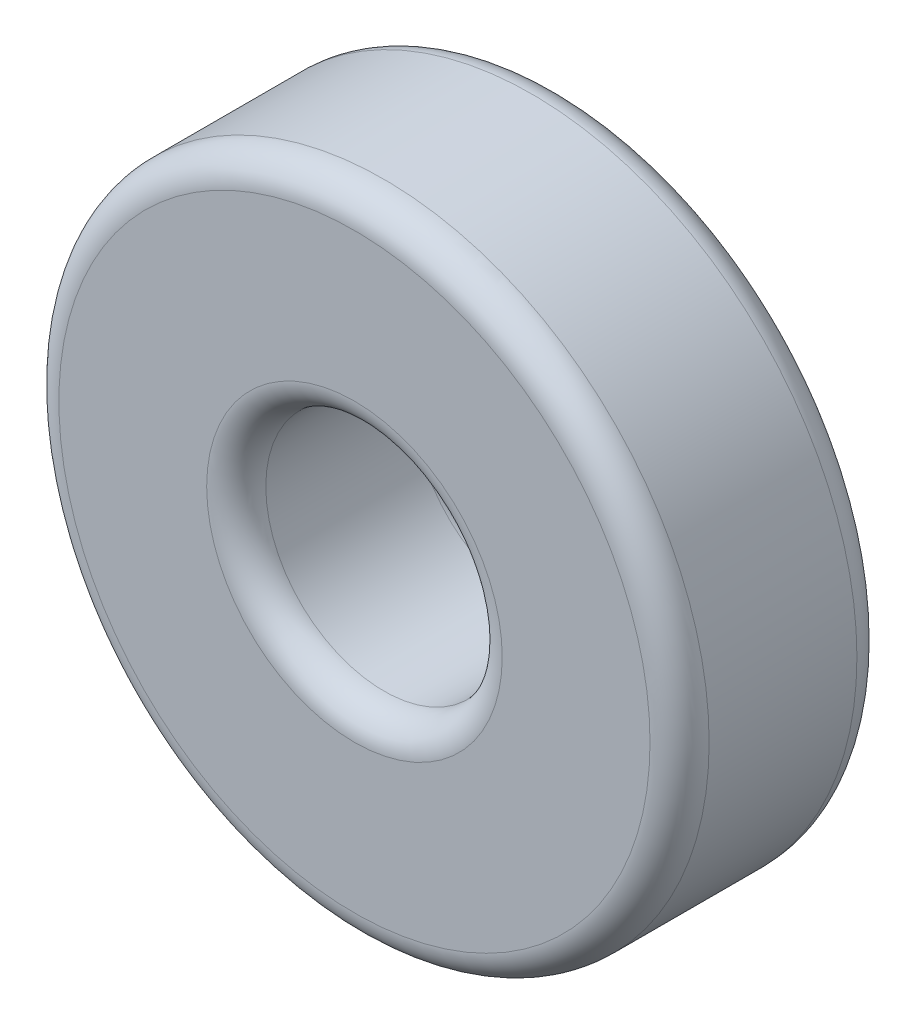
ISO-10303-21;
HEADER;
FILE_DESCRIPTION(('STEP AP214'),'2;1');
FILE_NAME('part.step','',(''),(''),'','','');
FILE_SCHEMA(('AUTOMOTIVE_DESIGN { 1 0 10303 214 1 1 1 1 }'));
ENDSEC;
DATA;
#1=APPLICATION_CONTEXT('core data for automotive mechanical design processes');
#2=APPLICATION_PROTOCOL_DEFINITION('international standard','automotive_design',2000,#1);
#3=PRODUCT_CONTEXT('',#1,'mechanical');
#4=PRODUCT('Part','Part','',(#3));
#5=PRODUCT_RELATED_PRODUCT_CATEGORY('part','',(#4));
#6=PRODUCT_DEFINITION_FORMATION('','',#4);
#7=PRODUCT_DEFINITION_CONTEXT('part definition',#1,'design');
#8=PRODUCT_DEFINITION('design','',#6,#7);
#9=PRODUCT_DEFINITION_SHAPE('','',#8);
#10=(LENGTH_UNIT() NAMED_UNIT(*) SI_UNIT(.MILLI.,.METRE.));
#11=(NAMED_UNIT(*) PLANE_ANGLE_UNIT() SI_UNIT($,.RADIAN.));
#12=(NAMED_UNIT(*) SI_UNIT($,.STERADIAN.) SOLID_ANGLE_UNIT());
#13=UNCERTAINTY_MEASURE_WITH_UNIT(LENGTH_MEASURE(1.E-05),#10,'distance_accuracy_value','');
#14=(GEOMETRIC_REPRESENTATION_CONTEXT(3) GLOBAL_UNCERTAINTY_ASSIGNED_CONTEXT((#13)) GLOBAL_UNIT_ASSIGNED_CONTEXT((#10,
#11,#12)) REPRESENTATION_CONTEXT('',''));
#15=CARTESIAN_POINT('',(0.,0.,0.));
#16=DIRECTION('',(0.,0.,1.));
#17=DIRECTION('',(1.,0.,0.));
#18=AXIS2_PLACEMENT_3D('',#15,#16,#17);
#19=CARTESIAN_POINT('',(0.,0.,7.));
#20=DIRECTION('',(0.,0.,1.));
#21=DIRECTION('',(1.,0.,0.));
#22=AXIS2_PLACEMENT_3D('',#19,#20,#21);
#23=PLANE('',#22);
#24=CARTESIAN_POINT('',(0.,0.,7.));
#25=DIRECTION('',(0.,0.,1.));
#26=DIRECTION('',(1.,0.,0.));
#27=AXIS2_PLACEMENT_3D('',#24,#25,#26);
#28=CIRCLE('',#27,5.);
#29=CARTESIAN_POINT('',(5.,0.,7.));
#30=VERTEX_POINT('',#29);
#31=EDGE_CURVE('E48',#30,#30,#28,.F.);
#32=ORIENTED_EDGE('',*,*,#31,.T.);
#33=EDGE_LOOP('',(#32));
#34=FACE_BOUND('',#33,.T.);
#35=CARTESIAN_POINT('',(0.,0.,7.));
#36=DIRECTION('',(0.,0.,1.));
#37=DIRECTION('',(1.,0.,0.));
#38=AXIS2_PLACEMENT_3D('',#35,#36,#37);
#39=CIRCLE('',#38,10.);
#40=CARTESIAN_POINT('',(10.,0.,7.));
#41=VERTEX_POINT('',#40);
#42=EDGE_CURVE('E52',#41,#41,#39,.T.);
#43=ORIENTED_EDGE('',*,*,#42,.T.);
#44=EDGE_LOOP('',(#43));
#45=FACE_BOUND('',#44,.T.);
#46=ADVANCED_FACE('F37',(#34,#45),#23,.T.);
#47=CARTESIAN_POINT('',(0.,0.,0.));
#48=DIRECTION('',(0.,0.,1.));
#49=DIRECTION('',(1.,0.,0.));
#50=AXIS2_PLACEMENT_3D('',#47,#48,#49);
#51=PLANE('',#50);
#52=CARTESIAN_POINT('',(0.,0.,0.));
#53=DIRECTION('',(0.,0.,1.));
#54=DIRECTION('',(1.,0.,0.));
#55=AXIS2_PLACEMENT_3D('',#52,#53,#54);
#56=CIRCLE('',#55,5.);
#57=CARTESIAN_POINT('',(5.,0.,0.));
#58=VERTEX_POINT('',#57);
#59=EDGE_CURVE('E63',#58,#58,#56,.T.);
#60=ORIENTED_EDGE('',*,*,#59,.T.);
#61=EDGE_LOOP('',(#60));
#62=FACE_BOUND('',#61,.T.);
#63=CARTESIAN_POINT('',(0.,0.,0.));
#64=DIRECTION('',(0.,0.,1.));
#65=DIRECTION('',(1.,0.,0.));
#66=AXIS2_PLACEMENT_3D('',#63,#64,#65);
#67=CIRCLE('',#66,10.);
#68=CARTESIAN_POINT('',(10.,0.,0.));
#69=VERTEX_POINT('',#68);
#70=EDGE_CURVE('E66',#69,#69,#67,.F.);
#71=ORIENTED_EDGE('',*,*,#70,.T.);
#72=EDGE_LOOP('',(#71));
#73=FACE_BOUND('',#72,.T.);
#74=ADVANCED_FACE('F70',(#62,#73),#51,.F.);
#75=CARTESIAN_POINT('',(0.,0.,7.));
#76=DIRECTION('',(0.,0.,-1.));
#77=DIRECTION('',(-1.,0.,0.));
#78=AXIS2_PLACEMENT_3D('',#75,#76,#77);
#79=CYLINDRICAL_SURFACE('',#78,11.);
#80=CARTESIAN_POINT('',(0.,0.,1.));
#81=DIRECTION('',(0.,0.,1.));
#82=DIRECTION('',(1.,0.,0.));
#83=AXIS2_PLACEMENT_3D('',#80,#81,#82);
#84=CIRCLE('',#83,11.);
#85=CARTESIAN_POINT('',(11.,0.,1.));
#86=VERTEX_POINT('',#85);
#87=EDGE_CURVE('E10',#86,#86,#84,.T.);
#88=ORIENTED_EDGE('',*,*,#87,.T.);
#89=EDGE_LOOP('',(#88));
#90=FACE_BOUND('',#89,.T.);
#91=CARTESIAN_POINT('',(0.,0.,6.));
#92=DIRECTION('',(0.,0.,1.));
#93=DIRECTION('',(1.,0.,0.));
#94=AXIS2_PLACEMENT_3D('',#91,#92,#93);
#95=CIRCLE('',#94,11.);
#96=CARTESIAN_POINT('',(11.,0.,6.));
#97=VERTEX_POINT('',#96);
#98=EDGE_CURVE('E44',#97,#97,#95,.F.);
#99=ORIENTED_EDGE('',*,*,#98,.T.);
#100=EDGE_LOOP('',(#99));
#101=FACE_BOUND('',#100,.T.);
#102=ADVANCED_FACE('F90',(#90,#101),#79,.T.);
#103=CARTESIAN_POINT('',(0.,0.,7.));
#104=DIRECTION('',(0.,0.,-1.));
#105=DIRECTION('',(-1.,0.,0.));
#106=AXIS2_PLACEMENT_3D('',#103,#104,#105);
#107=CYLINDRICAL_SURFACE('',#106,4.);
#108=CARTESIAN_POINT('',(0.,0.,1.));
#109=DIRECTION('',(0.,0.,1.));
#110=DIRECTION('',(1.,0.,0.));
#111=AXIS2_PLACEMENT_3D('',#108,#109,#110);
#112=CIRCLE('',#111,4.);
#113=CARTESIAN_POINT('',(4.,0.,1.));
#114=VERTEX_POINT('',#113);
#115=EDGE_CURVE('E57',#114,#114,#112,.F.);
#116=ORIENTED_EDGE('',*,*,#115,.T.);
#117=EDGE_LOOP('',(#116));
#118=FACE_BOUND('',#117,.T.);
#119=CARTESIAN_POINT('',(0.,0.,6.));
#120=DIRECTION('',(0.,0.,1.));
#121=DIRECTION('',(1.,0.,0.));
#122=AXIS2_PLACEMENT_3D('',#119,#120,#121);
#123=CIRCLE('',#122,4.);
#124=CARTESIAN_POINT('',(4.,0.,6.));
#125=VERTEX_POINT('',#124);
#126=EDGE_CURVE('E60',#125,#125,#123,.T.);
#127=ORIENTED_EDGE('',*,*,#126,.T.);
#128=EDGE_LOOP('',(#127));
#129=FACE_BOUND('',#128,.T.);
#130=ADVANCED_FACE('F95',(#118,#129),#107,.F.);
#131=CARTESIAN_POINT('',(0.,0.,1.));
#132=DIRECTION('',(0.,0.,1.));
#133=DIRECTION('',(1.,0.,0.));
#134=AXIS2_PLACEMENT_3D('',#131,#132,#133);
#135=TOROIDAL_SURFACE('',#134,5.,1.);
#136=ORIENTED_EDGE('',*,*,#115,.F.);
#137=EDGE_LOOP('',(#136));
#138=FACE_BOUND('',#137,.T.);
#139=ORIENTED_EDGE('',*,*,#59,.F.);
#140=EDGE_LOOP('',(#139));
#141=FACE_BOUND('',#140,.T.);
#142=ADVANCED_FACE('F81',(#138,#141),#135,.T.);
#143=CARTESIAN_POINT('',(0.,0.,6.));
#144=DIRECTION('',(0.,0.,1.));
#145=DIRECTION('',(1.,0.,0.));
#146=AXIS2_PLACEMENT_3D('',#143,#144,#145);
#147=TOROIDAL_SURFACE('',#146,5.,1.);
#148=ORIENTED_EDGE('',*,*,#31,.F.);
#149=EDGE_LOOP('',(#148));
#150=FACE_BOUND('',#149,.T.);
#151=ORIENTED_EDGE('',*,*,#126,.F.);
#152=EDGE_LOOP('',(#151));
#153=FACE_BOUND('',#152,.T.);
#154=ADVANCED_FACE('F75',(#150,#153),#147,.T.);
#155=CARTESIAN_POINT('',(0.,0.,1.));
#156=DIRECTION('',(0.,0.,1.));
#157=DIRECTION('',(1.,0.,0.));
#158=AXIS2_PLACEMENT_3D('',#155,#156,#157);
#159=TOROIDAL_SURFACE('',#158,10.,1.);
#160=ORIENTED_EDGE('',*,*,#70,.F.);
#161=EDGE_LOOP('',(#160));
#162=FACE_BOUND('',#161,.T.);
#163=ORIENTED_EDGE('',*,*,#87,.F.);
#164=EDGE_LOOP('',(#163));
#165=FACE_BOUND('',#164,.T.);
#166=ADVANCED_FACE('F72',(#162,#165),#159,.T.);
#167=CARTESIAN_POINT('',(0.,0.,6.));
#168=DIRECTION('',(0.,0.,1.));
#169=DIRECTION('',(1.,0.,0.));
#170=AXIS2_PLACEMENT_3D('',#167,#168,#169);
#171=TOROIDAL_SURFACE('',#170,10.,1.);
#172=ORIENTED_EDGE('',*,*,#98,.F.);
#173=EDGE_LOOP('',(#172));
#174=FACE_BOUND('',#173,.T.);
#175=ORIENTED_EDGE('',*,*,#42,.F.);
#176=EDGE_LOOP('',(#175));
#177=FACE_BOUND('',#176,.T.);
#178=ADVANCED_FACE('F39',(#174,#177),#171,.T.);
#179=CLOSED_SHELL('',(#46,#74,#102,#130,#142,#154,#166,#178));
#180=MANIFOLD_SOLID_BREP('B2',#179);
#181=ADVANCED_BREP_SHAPE_REPRESENTATION('',(#18,#180),#14);
#182=SHAPE_DEFINITION_REPRESENTATION(#9,#181);
ENDSEC;
END-ISO-10303-21;
